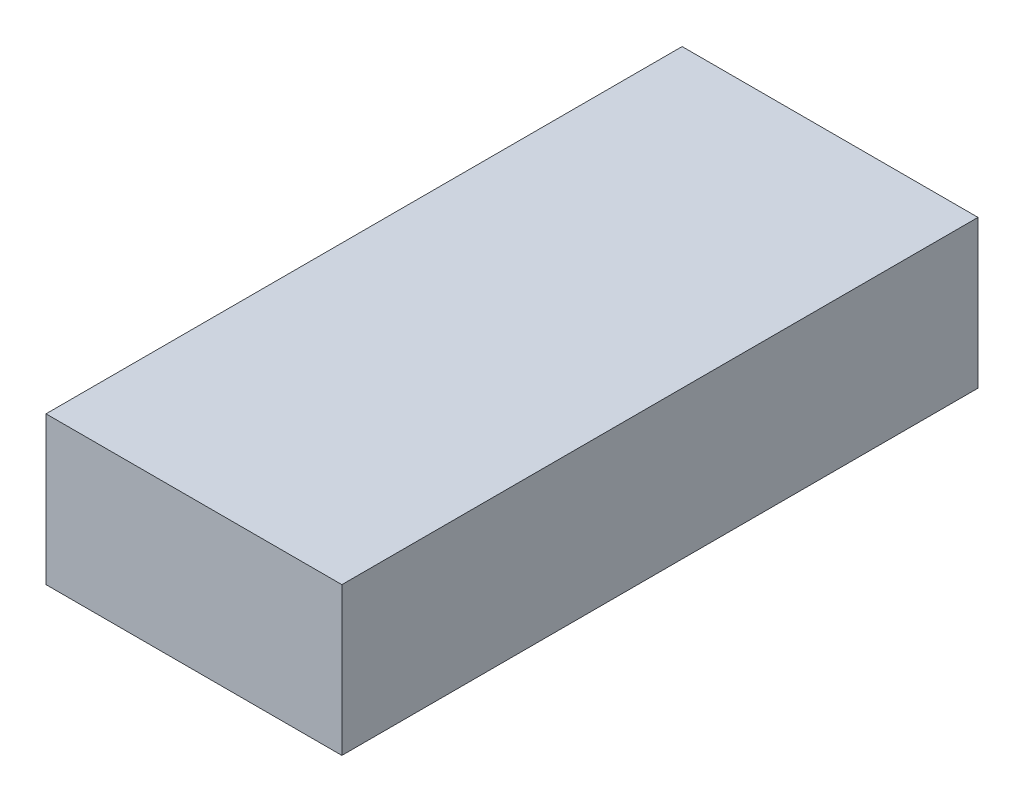
ISO-10303-21;
HEADER;
FILE_DESCRIPTION(('STEP AP214'),'2;1');
FILE_NAME('part.step','',(''),(''),'','','');
FILE_SCHEMA(('AUTOMOTIVE_DESIGN { 1 0 10303 214 1 1 1 1 }'));
ENDSEC;
DATA;
#1=APPLICATION_CONTEXT('core data for automotive mechanical design processes');
#2=APPLICATION_PROTOCOL_DEFINITION('international standard','automotive_design',2000,#1);
#3=PRODUCT_CONTEXT('',#1,'mechanical');
#4=PRODUCT('Part','Part','',(#3));
#5=PRODUCT_RELATED_PRODUCT_CATEGORY('part','',(#4));
#6=PRODUCT_DEFINITION_FORMATION('','',#4);
#7=PRODUCT_DEFINITION_CONTEXT('part definition',#1,'design');
#8=PRODUCT_DEFINITION('design','',#6,#7);
#9=PRODUCT_DEFINITION_SHAPE('','',#8);
#10=(LENGTH_UNIT() NAMED_UNIT(*) SI_UNIT(.MILLI.,.METRE.));
#11=(NAMED_UNIT(*) PLANE_ANGLE_UNIT() SI_UNIT($,.RADIAN.));
#12=(NAMED_UNIT(*) SI_UNIT($,.STERADIAN.) SOLID_ANGLE_UNIT());
#13=UNCERTAINTY_MEASURE_WITH_UNIT(LENGTH_MEASURE(1.E-05),#10,'distance_accuracy_value','');
#14=(GEOMETRIC_REPRESENTATION_CONTEXT(3) GLOBAL_UNCERTAINTY_ASSIGNED_CONTEXT((#13)) GLOBAL_UNIT_ASSIGNED_CONTEXT((#10,
#11,#12)) REPRESENTATION_CONTEXT('',''));
#15=CARTESIAN_POINT('',(0.,0.,0.));
#16=DIRECTION('',(0.,0.,1.));
#17=DIRECTION('',(1.,0.,0.));
#18=AXIS2_PLACEMENT_3D('',#15,#16,#17);
#19=CARTESIAN_POINT('',(10.,10.,-21.5));
#20=DIRECTION('',(-1.,0.,0.));
#21=DIRECTION('',(0.,0.,1.));
#22=AXIS2_PLACEMENT_3D('',#19,#20,#21);
#23=PLANE('',#22);
#24=DIRECTION('',(0.,0.,-1.));
#25=VECTOR('',#24,1.);
#26=CARTESIAN_POINT('',(10.,0.,-21.5));
#27=LINE('',#26,#25);
#28=CARTESIAN_POINT('',(10.,0.,21.5));
#29=VERTEX_POINT('',#28);
#30=CARTESIAN_POINT('',(10.,0.,-21.5));
#31=VERTEX_POINT('',#30);
#32=EDGE_CURVE('E95',#29,#31,#27,.T.);
#33=ORIENTED_EDGE('',*,*,#32,.T.);
#34=DIRECTION('',(0.,-1.,0.));
#35=VECTOR('',#34,1.);
#36=CARTESIAN_POINT('',(10.,10.,-21.5));
#37=LINE('',#36,#35);
#38=CARTESIAN_POINT('',(10.,10.,-21.5));
#39=VERTEX_POINT('',#38);
#40=EDGE_CURVE('E11',#39,#31,#37,.T.);
#41=ORIENTED_EDGE('',*,*,#40,.F.);
#42=DIRECTION('',(0.,0.,-1.));
#43=VECTOR('',#42,1.);
#44=CARTESIAN_POINT('',(10.,10.,-21.5));
#45=LINE('',#44,#43);
#46=CARTESIAN_POINT('',(10.,10.,21.5));
#47=VERTEX_POINT('',#46);
#48=EDGE_CURVE('E83',#47,#39,#45,.T.);
#49=ORIENTED_EDGE('',*,*,#48,.F.);
#50=DIRECTION('',(0.,-1.,0.));
#51=VECTOR('',#50,1.);
#52=CARTESIAN_POINT('',(10.,10.,21.5));
#53=LINE('',#52,#51);
#54=EDGE_CURVE('E91',#47,#29,#53,.T.);
#55=ORIENTED_EDGE('',*,*,#54,.T.);
#56=EDGE_LOOP('',(#33,#41,#49,#55));
#57=FACE_BOUND('',#56,.T.);
#58=ADVANCED_FACE('F32',(#57),#23,.F.);
#59=CARTESIAN_POINT('',(-10.,10.,-21.5));
#60=DIRECTION('',(0.,0.,1.));
#61=DIRECTION('',(1.,0.,0.));
#62=AXIS2_PLACEMENT_3D('',#59,#60,#61);
#63=PLANE('',#62);
#64=DIRECTION('',(-1.,0.,0.));
#65=VECTOR('',#64,1.);
#66=CARTESIAN_POINT('',(-10.,0.,-21.5));
#67=LINE('',#66,#65);
#68=CARTESIAN_POINT('',(-10.,0.,-21.5));
#69=VERTEX_POINT('',#68);
#70=EDGE_CURVE('E87',#31,#69,#67,.T.);
#71=ORIENTED_EDGE('',*,*,#70,.T.);
#72=DIRECTION('',(0.,-1.,0.));
#73=VECTOR('',#72,1.);
#74=CARTESIAN_POINT('',(-10.,10.,-21.5));
#75=LINE('',#74,#73);
#76=CARTESIAN_POINT('',(-10.,10.,-21.5));
#77=VERTEX_POINT('',#76);
#78=EDGE_CURVE('E40',#77,#69,#75,.T.);
#79=ORIENTED_EDGE('',*,*,#78,.F.);
#80=DIRECTION('',(-1.,0.,0.));
#81=VECTOR('',#80,1.);
#82=CARTESIAN_POINT('',(-10.,10.,-21.5));
#83=LINE('',#82,#81);
#84=EDGE_CURVE('E78',#39,#77,#83,.T.);
#85=ORIENTED_EDGE('',*,*,#84,.F.);
#86=ORIENTED_EDGE('',*,*,#40,.T.);
#87=EDGE_LOOP('',(#71,#79,#85,#86));
#88=FACE_BOUND('',#87,.T.);
#89=ADVANCED_FACE('F86',(#88),#63,.F.);
#90=CARTESIAN_POINT('',(-10.,10.,-21.5));
#91=DIRECTION('',(1.,0.,0.));
#92=DIRECTION('',(0.,0.,-1.));
#93=AXIS2_PLACEMENT_3D('',#90,#91,#92);
#94=PLANE('',#93);
#95=DIRECTION('',(0.,0.,1.));
#96=VECTOR('',#95,1.);
#97=CARTESIAN_POINT('',(-10.,0.,-21.5));
#98=LINE('',#97,#96);
#99=CARTESIAN_POINT('',(-10.,0.,21.5));
#100=VERTEX_POINT('',#99);
#101=EDGE_CURVE('E65',#69,#100,#98,.T.);
#102=ORIENTED_EDGE('',*,*,#101,.T.);
#103=DIRECTION('',(0.,-1.,0.));
#104=VECTOR('',#103,1.);
#105=CARTESIAN_POINT('',(-10.,10.,21.5));
#106=LINE('',#105,#104);
#107=CARTESIAN_POINT('',(-10.,10.,21.5));
#108=VERTEX_POINT('',#107);
#109=EDGE_CURVE('E88',#108,#100,#106,.T.);
#110=ORIENTED_EDGE('',*,*,#109,.F.);
#111=DIRECTION('',(0.,0.,1.));
#112=VECTOR('',#111,1.);
#113=CARTESIAN_POINT('',(-10.,10.,-21.5));
#114=LINE('',#113,#112);
#115=EDGE_CURVE('E81',#77,#108,#114,.T.);
#116=ORIENTED_EDGE('',*,*,#115,.F.);
#117=ORIENTED_EDGE('',*,*,#78,.T.);
#118=EDGE_LOOP('',(#102,#110,#116,#117));
#119=FACE_BOUND('',#118,.T.);
#120=ADVANCED_FACE('F89',(#119),#94,.F.);
#121=CARTESIAN_POINT('',(-10.,10.,21.5));
#122=DIRECTION('',(0.,0.,-1.));
#123=DIRECTION('',(-1.,0.,0.));
#124=AXIS2_PLACEMENT_3D('',#121,#122,#123);
#125=PLANE('',#124);
#126=DIRECTION('',(1.,0.,0.));
#127=VECTOR('',#126,1.);
#128=CARTESIAN_POINT('',(-10.,0.,21.5));
#129=LINE('',#128,#127);
#130=EDGE_CURVE('E71',#100,#29,#129,.T.);
#131=ORIENTED_EDGE('',*,*,#130,.T.);
#132=ORIENTED_EDGE('',*,*,#54,.F.);
#133=DIRECTION('',(1.,0.,0.));
#134=VECTOR('',#133,1.);
#135=CARTESIAN_POINT('',(-10.,10.,21.5));
#136=LINE('',#135,#134);
#137=EDGE_CURVE('E48',#108,#47,#136,.T.);
#138=ORIENTED_EDGE('',*,*,#137,.F.);
#139=ORIENTED_EDGE('',*,*,#109,.T.);
#140=EDGE_LOOP('',(#131,#132,#138,#139));
#141=FACE_BOUND('',#140,.T.);
#142=ADVANCED_FACE('F102',(#141),#125,.F.);
#143=CARTESIAN_POINT('',(0.,10.,0.));
#144=DIRECTION('',(0.,1.,0.));
#145=DIRECTION('',(0.,0.,1.));
#146=AXIS2_PLACEMENT_3D('',#143,#144,#145);
#147=PLANE('',#146);
#148=ORIENTED_EDGE('',*,*,#48,.T.);
#149=ORIENTED_EDGE('',*,*,#84,.T.);
#150=ORIENTED_EDGE('',*,*,#115,.T.);
#151=ORIENTED_EDGE('',*,*,#137,.T.);
#152=EDGE_LOOP('',(#148,#149,#150,#151));
#153=FACE_BOUND('',#152,.T.);
#154=ADVANCED_FACE('F79',(#153),#147,.T.);
#155=CARTESIAN_POINT('',(0.,0.,0.));
#156=DIRECTION('',(0.,1.,0.));
#157=DIRECTION('',(0.,0.,1.));
#158=AXIS2_PLACEMENT_3D('',#155,#156,#157);
#159=PLANE('',#158);
#160=ORIENTED_EDGE('',*,*,#32,.F.);
#161=ORIENTED_EDGE('',*,*,#130,.F.);
#162=ORIENTED_EDGE('',*,*,#101,.F.);
#163=ORIENTED_EDGE('',*,*,#70,.F.);
#164=EDGE_LOOP('',(#160,#161,#162,#163));
#165=FACE_BOUND('',#164,.T.);
#166=ADVANCED_FACE('F105',(#165),#159,.F.);
#167=CLOSED_SHELL('',(#58,#89,#120,#142,#154,#166));
#168=MANIFOLD_SOLID_BREP('B2',#167);
#169=ADVANCED_BREP_SHAPE_REPRESENTATION('',(#18,#168),#14);
#170=SHAPE_DEFINITION_REPRESENTATION(#9,#169);
ENDSEC;
END-ISO-10303-21;
